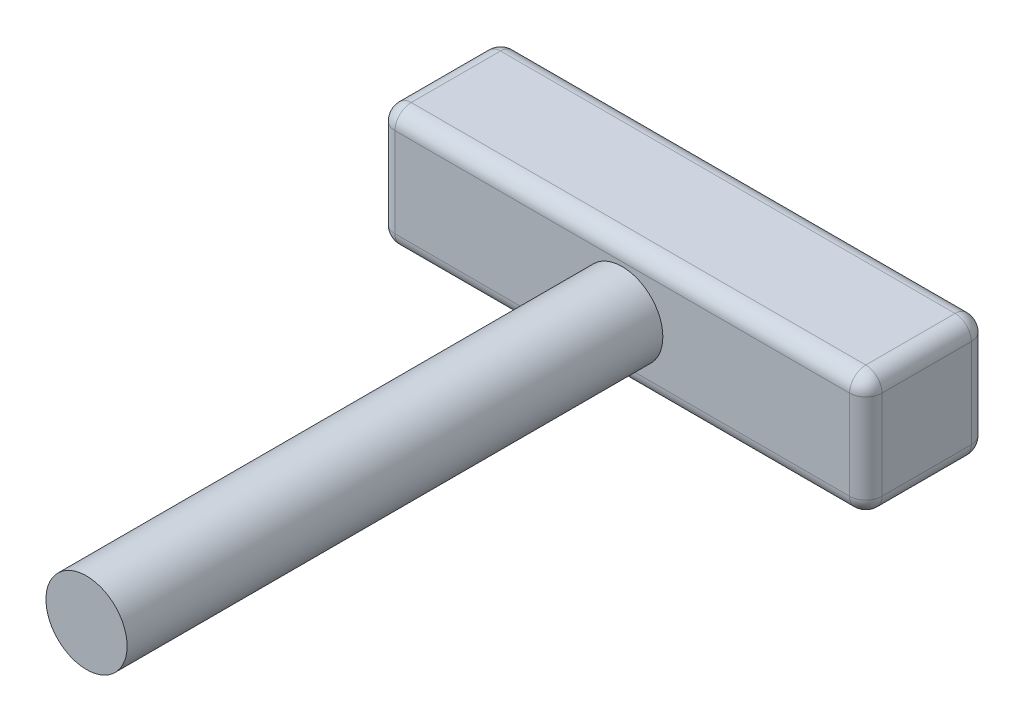
ISO-10303-21;
HEADER;
FILE_DESCRIPTION(('STEP AP214'),'2;1');
FILE_NAME('part.step','',(''),(''),'','','');
FILE_SCHEMA(('AUTOMOTIVE_DESIGN { 1 0 10303 214 1 1 1 1 }'));
ENDSEC;
DATA;
#1=APPLICATION_CONTEXT('core data for automotive mechanical design processes');
#2=APPLICATION_PROTOCOL_DEFINITION('international standard','automotive_design',2000,#1);
#3=PRODUCT_CONTEXT('',#1,'mechanical');
#4=PRODUCT('Part','Part','',(#3));
#5=PRODUCT_RELATED_PRODUCT_CATEGORY('part','',(#4));
#6=PRODUCT_DEFINITION_FORMATION('','',#4);
#7=PRODUCT_DEFINITION_CONTEXT('part definition',#1,'design');
#8=PRODUCT_DEFINITION('design','',#6,#7);
#9=PRODUCT_DEFINITION_SHAPE('','',#8);
#10=(LENGTH_UNIT() NAMED_UNIT(*) SI_UNIT(.MILLI.,.METRE.));
#11=(NAMED_UNIT(*) PLANE_ANGLE_UNIT() SI_UNIT($,.RADIAN.));
#12=(NAMED_UNIT(*) SI_UNIT($,.STERADIAN.) SOLID_ANGLE_UNIT());
#13=UNCERTAINTY_MEASURE_WITH_UNIT(LENGTH_MEASURE(1.E-05),#10,'distance_accuracy_value','');
#14=(GEOMETRIC_REPRESENTATION_CONTEXT(3) GLOBAL_UNCERTAINTY_ASSIGNED_CONTEXT((#13)) GLOBAL_UNIT_ASSIGNED_CONTEXT((#10,
#11,#12)) REPRESENTATION_CONTEXT('',''));
#15=CARTESIAN_POINT('',(0.,0.,0.));
#16=DIRECTION('',(0.,0.,1.));
#17=DIRECTION('',(1.,0.,0.));
#18=AXIS2_PLACEMENT_3D('',#15,#16,#17);
#19=CARTESIAN_POINT('',(60.,-7.49999999999999,7.5));
#20=DIRECTION('',(0.,0.,1.));
#21=DIRECTION('',(1.,0.,0.));
#22=AXIS2_PLACEMENT_3D('',#19,#20,#21);
#23=PLANE('',#22);
#24=DIRECTION('',(0.,1.,0.));
#25=VECTOR('',#24,1.);
#26=CARTESIAN_POINT('',(58.,7.50000000000001,7.5));
#27=LINE('',#26,#25);
#28=CARTESIAN_POINT('',(58.,-5.49999999999999,7.5));
#29=VERTEX_POINT('',#28);
#30=CARTESIAN_POINT('',(58.,5.50000000000001,7.5));
#31=VERTEX_POINT('',#30);
#32=EDGE_CURVE('E154',#29,#31,#27,.T.);
#33=ORIENTED_EDGE('',*,*,#32,.T.);
#34=DIRECTION('',(-1.,0.,0.));
#35=VECTOR('',#34,1.);
#36=CARTESIAN_POINT('',(60.,5.50000000000001,7.5));
#37=LINE('',#36,#35);
#38=CARTESIAN_POINT('',(2.,5.50000000000001,7.5));
#39=VERTEX_POINT('',#38);
#40=EDGE_CURVE('E125',#31,#39,#37,.T.);
#41=ORIENTED_EDGE('',*,*,#40,.T.);
#42=DIRECTION('',(0.,1.,0.));
#43=VECTOR('',#42,1.);
#44=CARTESIAN_POINT('',(2.,-7.49999999999999,7.5));
#45=LINE('',#44,#43);
#46=CARTESIAN_POINT('',(2.,-5.49999999999999,7.5));
#47=VERTEX_POINT('',#46);
#48=EDGE_CURVE('E143',#39,#47,#45,.F.);
#49=ORIENTED_EDGE('',*,*,#48,.T.);
#50=DIRECTION('',(-1.,0.,0.));
#51=VECTOR('',#50,1.);
#52=CARTESIAN_POINT('',(60.,-5.49999999999999,7.5));
#53=LINE('',#52,#51);
#54=EDGE_CURVE('E149',#47,#29,#53,.F.);
#55=ORIENTED_EDGE('',*,*,#54,.T.);
#56=EDGE_LOOP('',(#33,#41,#49,#55));
#57=FACE_BOUND('',#56,.T.);
#58=CARTESIAN_POINT('',(30.,0.,7.5));
#59=DIRECTION('',(0.,0.,1.));
#60=DIRECTION('',(1.,0.,0.));
#61=AXIS2_PLACEMENT_3D('',#58,#59,#60);
#62=CIRCLE('',#61,5.);
#63=CARTESIAN_POINT('',(35.,0.,7.5));
#64=VERTEX_POINT('',#63);
#65=EDGE_CURVE('E253',#64,#64,#62,.T.);
#66=ORIENTED_EDGE('',*,*,#65,.F.);
#67=EDGE_LOOP('',(#66));
#68=FACE_BOUND('',#67,.T.);
#69=ADVANCED_FACE('F32',(#57,#68),#23,.T.);
#70=CARTESIAN_POINT('',(60.,-7.49999999999999,7.5));
#71=DIRECTION('',(0.,1.,0.));
#72=DIRECTION('',(0.,0.,1.));
#73=AXIS2_PLACEMENT_3D('',#70,#71,#72);
#74=PLANE('',#73);
#75=DIRECTION('',(0.,0.,-1.));
#76=VECTOR('',#75,1.);
#77=CARTESIAN_POINT('',(58.,-7.49999999999999,7.5));
#78=LINE('',#77,#76);
#79=CARTESIAN_POINT('',(58.,-7.49999999999999,-5.5));
#80=VERTEX_POINT('',#79);
#81=CARTESIAN_POINT('',(58.,-7.49999999999999,5.5));
#82=VERTEX_POINT('',#81);
#83=EDGE_CURVE('E178',#80,#82,#78,.F.);
#84=ORIENTED_EDGE('',*,*,#83,.T.);
#85=DIRECTION('',(-1.,0.,0.));
#86=VECTOR('',#85,1.);
#87=CARTESIAN_POINT('',(0.,-7.49999999999999,5.5));
#88=LINE('',#87,#86);
#89=CARTESIAN_POINT('',(2.,-7.49999999999999,5.5));
#90=VERTEX_POINT('',#89);
#91=EDGE_CURVE('E182',#82,#90,#88,.T.);
#92=ORIENTED_EDGE('',*,*,#91,.T.);
#93=DIRECTION('',(0.,0.,-1.));
#94=VECTOR('',#93,1.);
#95=CARTESIAN_POINT('',(2.,-7.49999999999999,-7.5));
#96=LINE('',#95,#94);
#97=CARTESIAN_POINT('',(2.,-7.49999999999999,-5.5));
#98=VERTEX_POINT('',#97);
#99=EDGE_CURVE('E180',#90,#98,#96,.T.);
#100=ORIENTED_EDGE('',*,*,#99,.T.);
#101=DIRECTION('',(-1.,0.,0.));
#102=VECTOR('',#101,1.);
#103=CARTESIAN_POINT('',(60.,-7.49999999999999,-5.5));
#104=LINE('',#103,#102);
#105=EDGE_CURVE('E176',#98,#80,#104,.F.);
#106=ORIENTED_EDGE('',*,*,#105,.T.);
#107=EDGE_LOOP('',(#84,#92,#100,#106));
#108=FACE_BOUND('',#107,.T.);
#109=ADVANCED_FACE('F316',(#108),#74,.F.);
#110=CARTESIAN_POINT('',(60.,-7.49999999999999,-7.5));
#111=DIRECTION('',(0.,0.,1.));
#112=DIRECTION('',(1.,0.,0.));
#113=AXIS2_PLACEMENT_3D('',#110,#111,#112);
#114=PLANE('',#113);
#115=DIRECTION('',(0.,1.,0.));
#116=VECTOR('',#115,1.);
#117=CARTESIAN_POINT('',(58.,-7.49999999999999,-7.5));
#118=LINE('',#117,#116);
#119=CARTESIAN_POINT('',(58.,5.50000000000001,-7.5));
#120=VERTEX_POINT('',#119);
#121=CARTESIAN_POINT('',(58.,-5.49999999999999,-7.5));
#122=VERTEX_POINT('',#121);
#123=EDGE_CURVE('E52',#120,#122,#118,.F.);
#124=ORIENTED_EDGE('',*,*,#123,.T.);
#125=DIRECTION('',(-1.,0.,0.));
#126=VECTOR('',#125,1.);
#127=CARTESIAN_POINT('',(60.,-5.49999999999999,-7.5));
#128=LINE('',#127,#126);
#129=CARTESIAN_POINT('',(2.,-5.49999999999999,-7.5));
#130=VERTEX_POINT('',#129);
#131=EDGE_CURVE('E11',#122,#130,#128,.T.);
#132=ORIENTED_EDGE('',*,*,#131,.T.);
#133=DIRECTION('',(0.,1.,0.));
#134=VECTOR('',#133,1.);
#135=CARTESIAN_POINT('',(2.,7.50000000000001,-7.5));
#136=LINE('',#135,#134);
#137=CARTESIAN_POINT('',(2.,5.50000000000001,-7.5));
#138=VERTEX_POINT('',#137);
#139=EDGE_CURVE('E41',#130,#138,#136,.T.);
#140=ORIENTED_EDGE('',*,*,#139,.T.);
#141=DIRECTION('',(-1.,0.,0.));
#142=VECTOR('',#141,1.);
#143=CARTESIAN_POINT('',(60.,5.50000000000001,-7.5));
#144=LINE('',#143,#142);
#145=EDGE_CURVE('E194',#138,#120,#144,.F.);
#146=ORIENTED_EDGE('',*,*,#145,.T.);
#147=EDGE_LOOP('',(#124,#132,#140,#146));
#148=FACE_BOUND('',#147,.T.);
#149=ADVANCED_FACE('F321',(#148),#114,.F.);
#150=CARTESIAN_POINT('',(60.,7.50000000000001,7.5));
#151=DIRECTION('',(0.,1.,0.));
#152=DIRECTION('',(0.,0.,1.));
#153=AXIS2_PLACEMENT_3D('',#150,#151,#152);
#154=PLANE('',#153);
#155=DIRECTION('',(0.,0.,-1.));
#156=VECTOR('',#155,1.);
#157=CARTESIAN_POINT('',(2.,7.50000000000001,7.5));
#158=LINE('',#157,#156);
#159=CARTESIAN_POINT('',(2.,7.50000000000001,-5.5));
#160=VERTEX_POINT('',#159);
#161=CARTESIAN_POINT('',(2.,7.50000000000001,5.5));
#162=VERTEX_POINT('',#161);
#163=EDGE_CURVE('E164',#160,#162,#158,.F.);
#164=ORIENTED_EDGE('',*,*,#163,.T.);
#165=DIRECTION('',(-1.,0.,0.));
#166=VECTOR('',#165,1.);
#167=CARTESIAN_POINT('',(60.,7.50000000000001,5.5));
#168=LINE('',#167,#166);
#169=CARTESIAN_POINT('',(58.,7.50000000000001,5.5));
#170=VERTEX_POINT('',#169);
#171=EDGE_CURVE('E127',#162,#170,#168,.F.);
#172=ORIENTED_EDGE('',*,*,#171,.T.);
#173=DIRECTION('',(0.,0.,-1.));
#174=VECTOR('',#173,1.);
#175=CARTESIAN_POINT('',(58.,7.50000000000001,-7.5));
#176=LINE('',#175,#174);
#177=CARTESIAN_POINT('',(58.,7.50000000000001,-5.5));
#178=VERTEX_POINT('',#177);
#179=EDGE_CURVE('E158',#170,#178,#176,.T.);
#180=ORIENTED_EDGE('',*,*,#179,.T.);
#181=DIRECTION('',(-1.,0.,0.));
#182=VECTOR('',#181,1.);
#183=CARTESIAN_POINT('',(0.,7.50000000000001,-5.5));
#184=LINE('',#183,#182);
#185=EDGE_CURVE('E156',#178,#160,#184,.T.);
#186=ORIENTED_EDGE('',*,*,#185,.T.);
#187=EDGE_LOOP('',(#164,#172,#180,#186));
#188=FACE_BOUND('',#187,.T.);
#189=ADVANCED_FACE('F288',(#188),#154,.T.);
#190=CARTESIAN_POINT('',(60.,0.,0.));
#191=DIRECTION('',(-1.,0.,0.));
#192=DIRECTION('',(0.,0.,1.));
#193=AXIS2_PLACEMENT_3D('',#190,#191,#192);
#194=PLANE('',#193);
#195=DIRECTION('',(0.,1.,0.));
#196=VECTOR('',#195,1.);
#197=CARTESIAN_POINT('',(60.,-7.49999999999999,5.5));
#198=LINE('',#197,#196);
#199=CARTESIAN_POINT('',(60.,5.50000000000001,5.5));
#200=VERTEX_POINT('',#199);
#201=CARTESIAN_POINT('',(60.,-5.49999999999999,5.5));
#202=VERTEX_POINT('',#201);
#203=EDGE_CURVE('E171',#200,#202,#198,.F.);
#204=ORIENTED_EDGE('',*,*,#203,.T.);
#205=DIRECTION('',(0.,0.,-1.));
#206=VECTOR('',#205,1.);
#207=CARTESIAN_POINT('',(60.,-5.49999999999999,0.));
#208=LINE('',#207,#206);
#209=CARTESIAN_POINT('',(60.,-5.49999999999999,-5.5));
#210=VERTEX_POINT('',#209);
#211=EDGE_CURVE('E174',#202,#210,#208,.T.);
#212=ORIENTED_EDGE('',*,*,#211,.T.);
#213=DIRECTION('',(0.,1.,0.));
#214=VECTOR('',#213,1.);
#215=CARTESIAN_POINT('',(60.,0.,-5.5));
#216=LINE('',#215,#214);
#217=CARTESIAN_POINT('',(60.,5.50000000000001,-5.5));
#218=VERTEX_POINT('',#217);
#219=EDGE_CURVE('E169',#210,#218,#216,.T.);
#220=ORIENTED_EDGE('',*,*,#219,.T.);
#221=DIRECTION('',(0.,0.,-1.));
#222=VECTOR('',#221,1.);
#223=CARTESIAN_POINT('',(60.,5.50000000000001,7.5));
#224=LINE('',#223,#222);
#225=EDGE_CURVE('E167',#218,#200,#224,.F.);
#226=ORIENTED_EDGE('',*,*,#225,.T.);
#227=EDGE_LOOP('',(#204,#212,#220,#226));
#228=FACE_BOUND('',#227,.T.);
#229=ADVANCED_FACE('F501',(#228),#194,.F.);
#230=CARTESIAN_POINT('',(0.,0.,0.));
#231=DIRECTION('',(-1.,0.,0.));
#232=DIRECTION('',(0.,0.,1.));
#233=AXIS2_PLACEMENT_3D('',#230,#231,#232);
#234=PLANE('',#233);
#235=DIRECTION('',(0.,1.,0.));
#236=VECTOR('',#235,1.);
#237=CARTESIAN_POINT('',(0.,-7.49999999999999,-5.5));
#238=LINE('',#237,#236);
#239=CARTESIAN_POINT('',(0.,5.50000000000001,-5.5));
#240=VERTEX_POINT('',#239);
#241=CARTESIAN_POINT('',(0.,-5.49999999999999,-5.5));
#242=VERTEX_POINT('',#241);
#243=EDGE_CURVE('E187',#240,#242,#238,.F.);
#244=ORIENTED_EDGE('',*,*,#243,.T.);
#245=DIRECTION('',(0.,0.,-1.));
#246=VECTOR('',#245,1.);
#247=CARTESIAN_POINT('',(0.,-5.49999999999999,7.5));
#248=LINE('',#247,#246);
#249=CARTESIAN_POINT('',(0.,-5.49999999999999,5.5));
#250=VERTEX_POINT('',#249);
#251=EDGE_CURVE('E192',#242,#250,#248,.F.);
#252=ORIENTED_EDGE('',*,*,#251,.T.);
#253=DIRECTION('',(0.,1.,0.));
#254=VECTOR('',#253,1.);
#255=CARTESIAN_POINT('',(0.,0.,5.5));
#256=LINE('',#255,#254);
#257=CARTESIAN_POINT('',(0.,5.50000000000001,5.5));
#258=VERTEX_POINT('',#257);
#259=EDGE_CURVE('E189',#250,#258,#256,.T.);
#260=ORIENTED_EDGE('',*,*,#259,.T.);
#261=DIRECTION('',(0.,0.,-1.));
#262=VECTOR('',#261,1.);
#263=CARTESIAN_POINT('',(0.,5.50000000000001,0.));
#264=LINE('',#263,#262);
#265=EDGE_CURVE('E185',#258,#240,#264,.T.);
#266=ORIENTED_EDGE('',*,*,#265,.T.);
#267=EDGE_LOOP('',(#244,#252,#260,#266));
#268=FACE_BOUND('',#267,.T.);
#269=ADVANCED_FACE('F296',(#268),#234,.T.);
#270=CARTESIAN_POINT('',(30.,0.,73.5));
#271=DIRECTION('',(0.,0.,-1.));
#272=DIRECTION('',(-1.,0.,0.));
#273=AXIS2_PLACEMENT_3D('',#270,#271,#272);
#274=CYLINDRICAL_SURFACE('',#273,5.);
#275=CARTESIAN_POINT('',(30.,0.,73.5));
#276=DIRECTION('',(0.,0.,1.));
#277=DIRECTION('',(1.,0.,0.));
#278=AXIS2_PLACEMENT_3D('',#275,#276,#277);
#279=CIRCLE('',#278,5.);
#280=CARTESIAN_POINT('',(35.,0.,73.5));
#281=VERTEX_POINT('',#280);
#282=EDGE_CURVE('E150',#281,#281,#279,.T.);
#283=ORIENTED_EDGE('',*,*,#282,.F.);
#284=EDGE_LOOP('',(#283));
#285=FACE_BOUND('',#284,.T.);
#286=ORIENTED_EDGE('',*,*,#65,.T.);
#287=EDGE_LOOP('',(#286));
#288=FACE_BOUND('',#287,.T.);
#289=ADVANCED_FACE('F485',(#285,#288),#274,.T.);
#290=CARTESIAN_POINT('',(30.,0.,73.5));
#291=DIRECTION('',(0.,0.,1.));
#292=DIRECTION('',(1.,0.,0.));
#293=AXIS2_PLACEMENT_3D('',#290,#291,#292);
#294=PLANE('',#293);
#295=ORIENTED_EDGE('',*,*,#282,.T.);
#296=EDGE_LOOP('',(#295));
#297=FACE_BOUND('',#296,.T.);
#298=ADVANCED_FACE('F476',(#297),#294,.T.);
#299=CARTESIAN_POINT('',(60.,-5.49999999999999,-5.5));
#300=DIRECTION('',(-1.,0.,0.));
#301=DIRECTION('',(0.,0.,1.));
#302=AXIS2_PLACEMENT_3D('',#299,#300,#301);
#303=CYLINDRICAL_SURFACE('',#302,2.);
#304=CARTESIAN_POINT('',(58.,-5.49999999999999,-5.5));
#305=DIRECTION('',(1.,0.,0.));
#306=DIRECTION('',(0.,0.,-1.));
#307=AXIS2_PLACEMENT_3D('',#304,#305,#306);
#308=CIRCLE('',#307,2.);
#309=EDGE_CURVE('E36',#80,#122,#308,.T.);
#310=ORIENTED_EDGE('',*,*,#309,.F.);
#311=ORIENTED_EDGE('',*,*,#105,.F.);
#312=CARTESIAN_POINT('',(2.,-5.49999999999999,-5.5));
#313=DIRECTION('',(-1.,0.,0.));
#314=DIRECTION('',(0.,0.,1.));
#315=AXIS2_PLACEMENT_3D('',#312,#313,#314);
#316=CIRCLE('',#315,2.);
#317=EDGE_CURVE('E247',#130,#98,#316,.T.);
#318=ORIENTED_EDGE('',*,*,#317,.F.);
#319=ORIENTED_EDGE('',*,*,#131,.F.);
#320=EDGE_LOOP('',(#310,#311,#318,#319));
#321=FACE_BOUND('',#320,.T.);
#322=ADVANCED_FACE('F34',(#321),#303,.T.);
#323=CARTESIAN_POINT('',(58.,-5.49999999999999,-5.5));
#324=DIRECTION('',(0.,0.,1.));
#325=DIRECTION('',(1.,0.,0.));
#326=AXIS2_PLACEMENT_3D('',#323,#324,#325);
#327=SPHERICAL_SURFACE('',#326,2.);
#328=CARTESIAN_POINT('',(58.,-5.49999999999999,-5.5));
#329=DIRECTION('',(0.,0.,-1.));
#330=DIRECTION('',(-1.,0.,0.));
#331=AXIS2_PLACEMENT_3D('',#328,#329,#330);
#332=CIRCLE('',#331,2.);
#333=EDGE_CURVE('E242',#80,#210,#332,.F.);
#334=ORIENTED_EDGE('',*,*,#333,.F.);
#335=ORIENTED_EDGE('',*,*,#309,.T.);
#336=CARTESIAN_POINT('',(58.,-5.49999999999999,-5.5));
#337=DIRECTION('',(0.,-1.,0.));
#338=DIRECTION('',(0.,0.,-1.));
#339=AXIS2_PLACEMENT_3D('',#336,#337,#338);
#340=CIRCLE('',#339,2.);
#341=EDGE_CURVE('E245',#210,#122,#340,.F.);
#342=ORIENTED_EDGE('',*,*,#341,.F.);
#343=EDGE_LOOP('',(#334,#335,#342));
#344=FACE_BOUND('',#343,.T.);
#345=ADVANCED_FACE('F462',(#344),#327,.T.);
#346=CARTESIAN_POINT('',(2.,-5.49999999999999,-5.5));
#347=DIRECTION('',(0.,0.,1.));
#348=DIRECTION('',(1.,0.,0.));
#349=AXIS2_PLACEMENT_3D('',#346,#347,#348);
#350=SPHERICAL_SURFACE('',#349,2.);
#351=CARTESIAN_POINT('',(2.,-5.49999999999999,-5.5));
#352=DIRECTION('',(0.,-1.,0.));
#353=DIRECTION('',(0.,0.,-1.));
#354=AXIS2_PLACEMENT_3D('',#351,#352,#353);
#355=CIRCLE('',#354,2.);
#356=EDGE_CURVE('E236',#130,#242,#355,.F.);
#357=ORIENTED_EDGE('',*,*,#356,.F.);
#358=ORIENTED_EDGE('',*,*,#317,.T.);
#359=CARTESIAN_POINT('',(2.,-5.49999999999999,-5.5));
#360=DIRECTION('',(0.,0.,-1.));
#361=DIRECTION('',(-1.,0.,0.));
#362=AXIS2_PLACEMENT_3D('',#359,#360,#361);
#363=CIRCLE('',#362,2.);
#364=EDGE_CURVE('E239',#242,#98,#363,.F.);
#365=ORIENTED_EDGE('',*,*,#364,.F.);
#366=EDGE_LOOP('',(#357,#358,#365));
#367=FACE_BOUND('',#366,.T.);
#368=ADVANCED_FACE('F453',(#367),#350,.T.);
#369=CARTESIAN_POINT('',(58.,0.,-5.5));
#370=DIRECTION('',(0.,1.,0.));
#371=DIRECTION('',(0.,0.,1.));
#372=AXIS2_PLACEMENT_3D('',#369,#370,#371);
#373=CYLINDRICAL_SURFACE('',#372,2.);
#374=ORIENTED_EDGE('',*,*,#341,.T.);
#375=ORIENTED_EDGE('',*,*,#123,.F.);
#376=CARTESIAN_POINT('',(58.,5.50000000000001,-5.5));
#377=DIRECTION('',(0.,1.,0.));
#378=DIRECTION('',(0.,0.,1.));
#379=AXIS2_PLACEMENT_3D('',#376,#377,#378);
#380=CIRCLE('',#379,2.);
#381=EDGE_CURVE('E230',#218,#120,#380,.T.);
#382=ORIENTED_EDGE('',*,*,#381,.F.);
#383=ORIENTED_EDGE('',*,*,#219,.F.);
#384=EDGE_LOOP('',(#374,#375,#382,#383));
#385=FACE_BOUND('',#384,.T.);
#386=ADVANCED_FACE('F444',(#385),#373,.T.);
#387=CARTESIAN_POINT('',(58.,-5.49999999999999,0.));
#388=DIRECTION('',(0.,0.,-1.));
#389=DIRECTION('',(-1.,0.,0.));
#390=AXIS2_PLACEMENT_3D('',#387,#388,#389);
#391=CYLINDRICAL_SURFACE('',#390,2.);
#392=ORIENTED_EDGE('',*,*,#333,.T.);
#393=ORIENTED_EDGE('',*,*,#211,.F.);
#394=CARTESIAN_POINT('',(58.,-5.49999999999999,5.5));
#395=DIRECTION('',(0.,0.,1.));
#396=DIRECTION('',(1.,0.,0.));
#397=AXIS2_PLACEMENT_3D('',#394,#395,#396);
#398=CIRCLE('',#397,2.);
#399=EDGE_CURVE('E227',#82,#202,#398,.T.);
#400=ORIENTED_EDGE('',*,*,#399,.F.);
#401=ORIENTED_EDGE('',*,*,#83,.F.);
#402=EDGE_LOOP('',(#392,#393,#400,#401));
#403=FACE_BOUND('',#402,.T.);
#404=ADVANCED_FACE('F436',(#403),#391,.T.);
#405=CARTESIAN_POINT('',(60.,-5.49999999999999,5.5));
#406=DIRECTION('',(1.,0.,0.));
#407=DIRECTION('',(0.,0.,-1.));
#408=AXIS2_PLACEMENT_3D('',#405,#406,#407);
#409=CYLINDRICAL_SURFACE('',#408,2.);
#410=CARTESIAN_POINT('',(2.,-5.49999999999999,5.5));
#411=DIRECTION('',(-1.,0.,0.));
#412=DIRECTION('',(0.,0.,1.));
#413=AXIS2_PLACEMENT_3D('',#410,#411,#412);
#414=CIRCLE('',#413,2.);
#415=EDGE_CURVE('E221',#90,#47,#414,.T.);
#416=ORIENTED_EDGE('',*,*,#415,.F.);
#417=ORIENTED_EDGE('',*,*,#91,.F.);
#418=CARTESIAN_POINT('',(58.,-5.49999999999999,5.5));
#419=DIRECTION('',(1.,0.,0.));
#420=DIRECTION('',(0.,0.,-1.));
#421=AXIS2_PLACEMENT_3D('',#418,#419,#420);
#422=CIRCLE('',#421,2.);
#423=EDGE_CURVE('E224',#29,#82,#422,.T.);
#424=ORIENTED_EDGE('',*,*,#423,.F.);
#425=ORIENTED_EDGE('',*,*,#54,.F.);
#426=EDGE_LOOP('',(#416,#417,#424,#425));
#427=FACE_BOUND('',#426,.T.);
#428=ADVANCED_FACE('F269',(#427),#409,.T.);
#429=CARTESIAN_POINT('',(2.,-5.49999999999999,7.5));
#430=DIRECTION('',(0.,0.,1.));
#431=DIRECTION('',(1.,0.,0.));
#432=AXIS2_PLACEMENT_3D('',#429,#430,#431);
#433=CYLINDRICAL_SURFACE('',#432,2.);
#434=ORIENTED_EDGE('',*,*,#364,.T.);
#435=ORIENTED_EDGE('',*,*,#99,.F.);
#436=CARTESIAN_POINT('',(2.,-5.49999999999999,5.5));
#437=DIRECTION('',(0.,0.,1.));
#438=DIRECTION('',(1.,0.,0.));
#439=AXIS2_PLACEMENT_3D('',#436,#437,#438);
#440=CIRCLE('',#439,2.);
#441=EDGE_CURVE('E219',#250,#90,#440,.T.);
#442=ORIENTED_EDGE('',*,*,#441,.F.);
#443=ORIENTED_EDGE('',*,*,#251,.F.);
#444=EDGE_LOOP('',(#434,#435,#442,#443));
#445=FACE_BOUND('',#444,.T.);
#446=ADVANCED_FACE('F301',(#445),#433,.T.);
#447=CARTESIAN_POINT('',(2.,-7.49999999999999,-5.5));
#448=DIRECTION('',(0.,-1.,0.));
#449=DIRECTION('',(0.,0.,-1.));
#450=AXIS2_PLACEMENT_3D('',#447,#448,#449);
#451=CYLINDRICAL_SURFACE('',#450,2.);
#452=ORIENTED_EDGE('',*,*,#356,.T.);
#453=ORIENTED_EDGE('',*,*,#243,.F.);
#454=CARTESIAN_POINT('',(2.,5.50000000000001,-5.5));
#455=DIRECTION('',(0.,1.,0.));
#456=DIRECTION('',(0.,0.,1.));
#457=AXIS2_PLACEMENT_3D('',#454,#455,#456);
#458=CIRCLE('',#457,2.);
#459=EDGE_CURVE('E216',#138,#240,#458,.T.);
#460=ORIENTED_EDGE('',*,*,#459,.F.);
#461=ORIENTED_EDGE('',*,*,#139,.F.);
#462=EDGE_LOOP('',(#452,#453,#460,#461));
#463=FACE_BOUND('',#462,.T.);
#464=ADVANCED_FACE('F412',(#463),#451,.T.);
#465=CARTESIAN_POINT('',(60.,5.50000000000001,-5.5));
#466=DIRECTION('',(1.,0.,0.));
#467=DIRECTION('',(0.,0.,-1.));
#468=AXIS2_PLACEMENT_3D('',#465,#466,#467);
#469=CYLINDRICAL_SURFACE('',#468,2.);
#470=CARTESIAN_POINT('',(58.,5.50000000000001,-5.5));
#471=DIRECTION('',(1.,0.,0.));
#472=DIRECTION('',(0.,0.,-1.));
#473=AXIS2_PLACEMENT_3D('',#470,#471,#472);
#474=CIRCLE('',#473,2.);
#475=EDGE_CURVE('E233',#120,#178,#474,.T.);
#476=ORIENTED_EDGE('',*,*,#475,.F.);
#477=ORIENTED_EDGE('',*,*,#145,.F.);
#478=CARTESIAN_POINT('',(2.,5.50000000000001,-5.5));
#479=DIRECTION('',(-1.,0.,0.));
#480=DIRECTION('',(0.,0.,1.));
#481=AXIS2_PLACEMENT_3D('',#478,#479,#480);
#482=CIRCLE('',#481,2.);
#483=EDGE_CURVE('E214',#160,#138,#482,.T.);
#484=ORIENTED_EDGE('',*,*,#483,.F.);
#485=ORIENTED_EDGE('',*,*,#185,.F.);
#486=EDGE_LOOP('',(#476,#477,#484,#485));
#487=FACE_BOUND('',#486,.T.);
#488=ADVANCED_FACE('F403',(#487),#469,.T.);
#489=CARTESIAN_POINT('',(58.,5.50000000000001,-5.5));
#490=DIRECTION('',(0.,0.,1.));
#491=DIRECTION('',(1.,0.,0.));
#492=AXIS2_PLACEMENT_3D('',#489,#490,#491);
#493=SPHERICAL_SURFACE('',#492,2.);
#494=ORIENTED_EDGE('',*,*,#381,.T.);
#495=ORIENTED_EDGE('',*,*,#475,.T.);
#496=CARTESIAN_POINT('',(58.,5.50000000000001,-5.5));
#497=DIRECTION('',(0.,0.,-1.));
#498=DIRECTION('',(-1.,0.,0.));
#499=AXIS2_PLACEMENT_3D('',#496,#497,#498);
#500=CIRCLE('',#499,2.);
#501=EDGE_CURVE('E211',#218,#178,#500,.F.);
#502=ORIENTED_EDGE('',*,*,#501,.F.);
#503=EDGE_LOOP('',(#494,#495,#502));
#504=FACE_BOUND('',#503,.T.);
#505=ADVANCED_FACE('F313',(#504),#493,.T.);
#506=CARTESIAN_POINT('',(58.,-5.49999999999999,5.5));
#507=DIRECTION('',(0.,0.,1.));
#508=DIRECTION('',(1.,0.,0.));
#509=AXIS2_PLACEMENT_3D('',#506,#507,#508);
#510=SPHERICAL_SURFACE('',#509,2.);
#511=ORIENTED_EDGE('',*,*,#423,.T.);
#512=ORIENTED_EDGE('',*,*,#399,.T.);
#513=CARTESIAN_POINT('',(58.,-5.49999999999999,5.5));
#514=DIRECTION('',(0.,-1.,0.));
#515=DIRECTION('',(0.,0.,-1.));
#516=AXIS2_PLACEMENT_3D('',#513,#514,#515);
#517=CIRCLE('',#516,2.);
#518=EDGE_CURVE('E209',#29,#202,#517,.F.);
#519=ORIENTED_EDGE('',*,*,#518,.F.);
#520=EDGE_LOOP('',(#511,#512,#519));
#521=FACE_BOUND('',#520,.T.);
#522=ADVANCED_FACE('F272',(#521),#510,.T.);
#523=CARTESIAN_POINT('',(2.,-5.49999999999999,5.5));
#524=DIRECTION('',(0.,0.,1.));
#525=DIRECTION('',(1.,0.,0.));
#526=AXIS2_PLACEMENT_3D('',#523,#524,#525);
#527=SPHERICAL_SURFACE('',#526,2.);
#528=ORIENTED_EDGE('',*,*,#441,.T.);
#529=ORIENTED_EDGE('',*,*,#415,.T.);
#530=CARTESIAN_POINT('',(2.,-5.49999999999999,5.5));
#531=DIRECTION('',(0.,-1.,0.));
#532=DIRECTION('',(0.,0.,-1.));
#533=AXIS2_PLACEMENT_3D('',#530,#531,#532);
#534=CIRCLE('',#533,2.);
#535=EDGE_CURVE('E146',#250,#47,#534,.F.);
#536=ORIENTED_EDGE('',*,*,#535,.F.);
#537=EDGE_LOOP('',(#528,#529,#536));
#538=FACE_BOUND('',#537,.T.);
#539=ADVANCED_FACE('F303',(#538),#527,.T.);
#540=CARTESIAN_POINT('',(2.,5.50000000000001,-5.5));
#541=DIRECTION('',(0.,0.,1.));
#542=DIRECTION('',(1.,0.,0.));
#543=AXIS2_PLACEMENT_3D('',#540,#541,#542);
#544=SPHERICAL_SURFACE('',#543,2.);
#545=ORIENTED_EDGE('',*,*,#483,.T.);
#546=ORIENTED_EDGE('',*,*,#459,.T.);
#547=CARTESIAN_POINT('',(2.,5.50000000000001,-5.5));
#548=DIRECTION('',(0.,0.,-1.));
#549=DIRECTION('',(-1.,0.,0.));
#550=AXIS2_PLACEMENT_3D('',#547,#548,#549);
#551=CIRCLE('',#550,2.);
#552=EDGE_CURVE('E205',#160,#240,#551,.F.);
#553=ORIENTED_EDGE('',*,*,#552,.F.);
#554=EDGE_LOOP('',(#545,#546,#553));
#555=FACE_BOUND('',#554,.T.);
#556=ADVANCED_FACE('F305',(#555),#544,.T.);
#557=CARTESIAN_POINT('',(58.,5.50000000000001,7.5));
#558=DIRECTION('',(0.,0.,1.));
#559=DIRECTION('',(1.,0.,0.));
#560=AXIS2_PLACEMENT_3D('',#557,#558,#559);
#561=CYLINDRICAL_SURFACE('',#560,2.);
#562=ORIENTED_EDGE('',*,*,#501,.T.);
#563=ORIENTED_EDGE('',*,*,#179,.F.);
#564=CARTESIAN_POINT('',(58.,5.50000000000001,5.5));
#565=DIRECTION('',(0.,0.,1.));
#566=DIRECTION('',(1.,0.,0.));
#567=AXIS2_PLACEMENT_3D('',#564,#565,#566);
#568=CIRCLE('',#567,2.);
#569=EDGE_CURVE('E202',#200,#170,#568,.T.);
#570=ORIENTED_EDGE('',*,*,#569,.F.);
#571=ORIENTED_EDGE('',*,*,#225,.F.);
#572=EDGE_LOOP('',(#562,#563,#570,#571));
#573=FACE_BOUND('',#572,.T.);
#574=ADVANCED_FACE('F284',(#573),#561,.T.);
#575=CARTESIAN_POINT('',(58.,-7.49999999999999,5.5));
#576=DIRECTION('',(0.,-1.,0.));
#577=DIRECTION('',(0.,0.,-1.));
#578=AXIS2_PLACEMENT_3D('',#575,#576,#577);
#579=CYLINDRICAL_SURFACE('',#578,2.);
#580=ORIENTED_EDGE('',*,*,#518,.T.);
#581=ORIENTED_EDGE('',*,*,#203,.F.);
#582=CARTESIAN_POINT('',(58.,5.50000000000001,5.5));
#583=DIRECTION('',(0.,1.,0.));
#584=DIRECTION('',(0.,0.,1.));
#585=AXIS2_PLACEMENT_3D('',#582,#583,#584);
#586=CIRCLE('',#585,2.);
#587=EDGE_CURVE('E140',#31,#200,#586,.T.);
#588=ORIENTED_EDGE('',*,*,#587,.F.);
#589=ORIENTED_EDGE('',*,*,#32,.F.);
#590=EDGE_LOOP('',(#580,#581,#588,#589));
#591=FACE_BOUND('',#590,.T.);
#592=ADVANCED_FACE('F276',(#591),#579,.T.);
#593=CARTESIAN_POINT('',(2.,0.,5.5));
#594=DIRECTION('',(0.,1.,0.));
#595=DIRECTION('',(0.,0.,1.));
#596=AXIS2_PLACEMENT_3D('',#593,#594,#595);
#597=CYLINDRICAL_SURFACE('',#596,2.);
#598=ORIENTED_EDGE('',*,*,#535,.T.);
#599=ORIENTED_EDGE('',*,*,#48,.F.);
#600=CARTESIAN_POINT('',(2.,5.50000000000001,5.5));
#601=DIRECTION('',(0.,1.,0.));
#602=DIRECTION('',(0.,0.,1.));
#603=AXIS2_PLACEMENT_3D('',#600,#601,#602);
#604=CIRCLE('',#603,2.);
#605=EDGE_CURVE('E132',#258,#39,#604,.T.);
#606=ORIENTED_EDGE('',*,*,#605,.F.);
#607=ORIENTED_EDGE('',*,*,#259,.F.);
#608=EDGE_LOOP('',(#598,#599,#606,#607));
#609=FACE_BOUND('',#608,.T.);
#610=ADVANCED_FACE('F144',(#609),#597,.T.);
#611=CARTESIAN_POINT('',(2.,5.50000000000001,0.));
#612=DIRECTION('',(0.,0.,-1.));
#613=DIRECTION('',(-1.,0.,0.));
#614=AXIS2_PLACEMENT_3D('',#611,#612,#613);
#615=CYLINDRICAL_SURFACE('',#614,2.);
#616=ORIENTED_EDGE('',*,*,#552,.T.);
#617=ORIENTED_EDGE('',*,*,#265,.F.);
#618=CARTESIAN_POINT('',(2.,5.50000000000001,5.5));
#619=DIRECTION('',(0.,0.,1.));
#620=DIRECTION('',(1.,0.,0.));
#621=AXIS2_PLACEMENT_3D('',#618,#619,#620);
#622=CIRCLE('',#621,2.);
#623=EDGE_CURVE('E136',#162,#258,#622,.T.);
#624=ORIENTED_EDGE('',*,*,#623,.F.);
#625=ORIENTED_EDGE('',*,*,#163,.F.);
#626=EDGE_LOOP('',(#616,#617,#624,#625));
#627=FACE_BOUND('',#626,.T.);
#628=ADVANCED_FACE('F292',(#627),#615,.T.);
#629=CARTESIAN_POINT('',(58.,5.50000000000001,5.5));
#630=DIRECTION('',(0.,0.,1.));
#631=DIRECTION('',(1.,0.,0.));
#632=AXIS2_PLACEMENT_3D('',#629,#630,#631);
#633=SPHERICAL_SURFACE('',#632,2.);
#634=ORIENTED_EDGE('',*,*,#587,.T.);
#635=ORIENTED_EDGE('',*,*,#569,.T.);
#636=CARTESIAN_POINT('',(58.,5.50000000000001,5.5));
#637=DIRECTION('',(1.,0.,0.));
#638=DIRECTION('',(0.,0.,-1.));
#639=AXIS2_PLACEMENT_3D('',#636,#637,#638);
#640=CIRCLE('',#639,2.);
#641=EDGE_CURVE('E129',#31,#170,#640,.F.);
#642=ORIENTED_EDGE('',*,*,#641,.F.);
#643=EDGE_LOOP('',(#634,#635,#642));
#644=FACE_BOUND('',#643,.T.);
#645=ADVANCED_FACE('F280',(#644),#633,.T.);
#646=CARTESIAN_POINT('',(2.,5.50000000000001,5.5));
#647=DIRECTION('',(0.,0.,1.));
#648=DIRECTION('',(1.,0.,0.));
#649=AXIS2_PLACEMENT_3D('',#646,#647,#648);
#650=SPHERICAL_SURFACE('',#649,2.);
#651=ORIENTED_EDGE('',*,*,#623,.T.);
#652=ORIENTED_EDGE('',*,*,#605,.T.);
#653=CARTESIAN_POINT('',(2.,5.50000000000001,5.5));
#654=DIRECTION('',(-1.,0.,0.));
#655=DIRECTION('',(0.,0.,1.));
#656=AXIS2_PLACEMENT_3D('',#653,#654,#655);
#657=CIRCLE('',#656,2.);
#658=EDGE_CURVE('E121',#162,#39,#657,.F.);
#659=ORIENTED_EDGE('',*,*,#658,.F.);
#660=EDGE_LOOP('',(#651,#652,#659));
#661=FACE_BOUND('',#660,.T.);
#662=ADVANCED_FACE('F134',(#661),#650,.T.);
#663=CARTESIAN_POINT('',(60.,5.50000000000001,5.5));
#664=DIRECTION('',(-1.,0.,0.));
#665=DIRECTION('',(0.,0.,1.));
#666=AXIS2_PLACEMENT_3D('',#663,#664,#665);
#667=CYLINDRICAL_SURFACE('',#666,2.);
#668=ORIENTED_EDGE('',*,*,#641,.T.);
#669=ORIENTED_EDGE('',*,*,#171,.F.);
#670=ORIENTED_EDGE('',*,*,#658,.T.);
#671=ORIENTED_EDGE('',*,*,#40,.F.);
#672=EDGE_LOOP('',(#668,#669,#670,#671));
#673=FACE_BOUND('',#672,.T.);
#674=ADVANCED_FACE('F123',(#673),#667,.T.);
#675=CLOSED_SHELL('',(#69,#109,#149,#189,#229,#269,#289,#298,#322,#345,#368,#386,#404,#428,#446,
#464,#488,#505,#522,#539,#556,#574,#592,#610,#628,#645,#662,#674));
#676=MANIFOLD_SOLID_BREP('B2',#675);
#677=ADVANCED_BREP_SHAPE_REPRESENTATION('',(#18,#676),#14);
#678=SHAPE_DEFINITION_REPRESENTATION(#9,#677);
ENDSEC;
END-ISO-10303-21;
